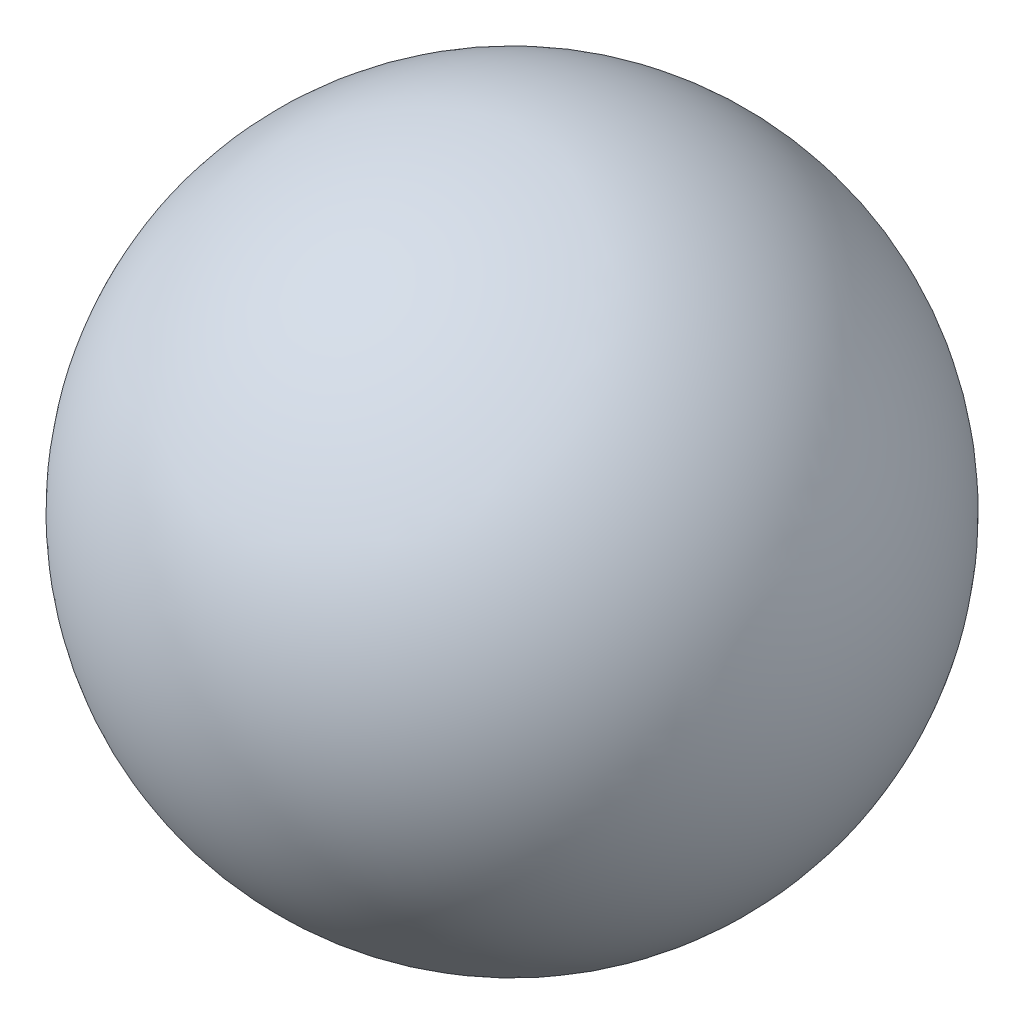
ISO-10303-21;
HEADER;
FILE_DESCRIPTION(('STEP AP214'),'2;1');
FILE_NAME('part.step','',(''),(''),'','','');
FILE_SCHEMA(('AUTOMOTIVE_DESIGN { 1 0 10303 214 1 1 1 1 }'));
ENDSEC;
DATA;
#1=APPLICATION_CONTEXT('core data for automotive mechanical design processes');
#2=APPLICATION_PROTOCOL_DEFINITION('international standard','automotive_design',2000,#1);
#3=PRODUCT_CONTEXT('',#1,'mechanical');
#4=PRODUCT('Part','Part','',(#3));
#5=PRODUCT_RELATED_PRODUCT_CATEGORY('part','',(#4));
#6=PRODUCT_DEFINITION_FORMATION('','',#4);
#7=PRODUCT_DEFINITION_CONTEXT('part definition',#1,'design');
#8=PRODUCT_DEFINITION('design','',#6,#7);
#9=PRODUCT_DEFINITION_SHAPE('','',#8);
#10=(LENGTH_UNIT() NAMED_UNIT(*) SI_UNIT(.MILLI.,.METRE.));
#11=(NAMED_UNIT(*) PLANE_ANGLE_UNIT() SI_UNIT($,.RADIAN.));
#12=(NAMED_UNIT(*) SI_UNIT($,.STERADIAN.) SOLID_ANGLE_UNIT());
#13=UNCERTAINTY_MEASURE_WITH_UNIT(LENGTH_MEASURE(1.E-05),#10,'distance_accuracy_value','');
#14=(GEOMETRIC_REPRESENTATION_CONTEXT(3) GLOBAL_UNCERTAINTY_ASSIGNED_CONTEXT((#13)) GLOBAL_UNIT_ASSIGNED_CONTEXT((#10,
#11,#12)) REPRESENTATION_CONTEXT('',''));
#15=CARTESIAN_POINT('',(0.,0.,0.));
#16=DIRECTION('',(0.,0.,1.));
#17=DIRECTION('',(1.,0.,0.));
#18=AXIS2_PLACEMENT_3D('',#15,#16,#17);
#19=CARTESIAN_POINT('',(0.,0.,0.));
#20=DIRECTION('',(1.,0.,0.));
#21=DIRECTION('',(0.,-1.,0.));
#22=AXIS2_PLACEMENT_3D('',#19,#20,#21);
#23=SPHERICAL_SURFACE('',#22,13.);
#24=CARTESIAN_POINT('',(13.,0.,0.));
#25=VERTEX_POINT('',#24);
#26=VERTEX_LOOP('',#25);
#27=FACE_BOUND('',#26,.T.);
#28=ADVANCED_FACE('F38',(#27),#23,.T.);
#29=CLOSED_SHELL('',(#28));
#30=MANIFOLD_SOLID_BREP('B2',#29);
#31=ADVANCED_BREP_SHAPE_REPRESENTATION('',(#18,#30),#14);
#32=SHAPE_DEFINITION_REPRESENTATION(#9,#31);
ENDSEC;
END-ISO-10303-21;
